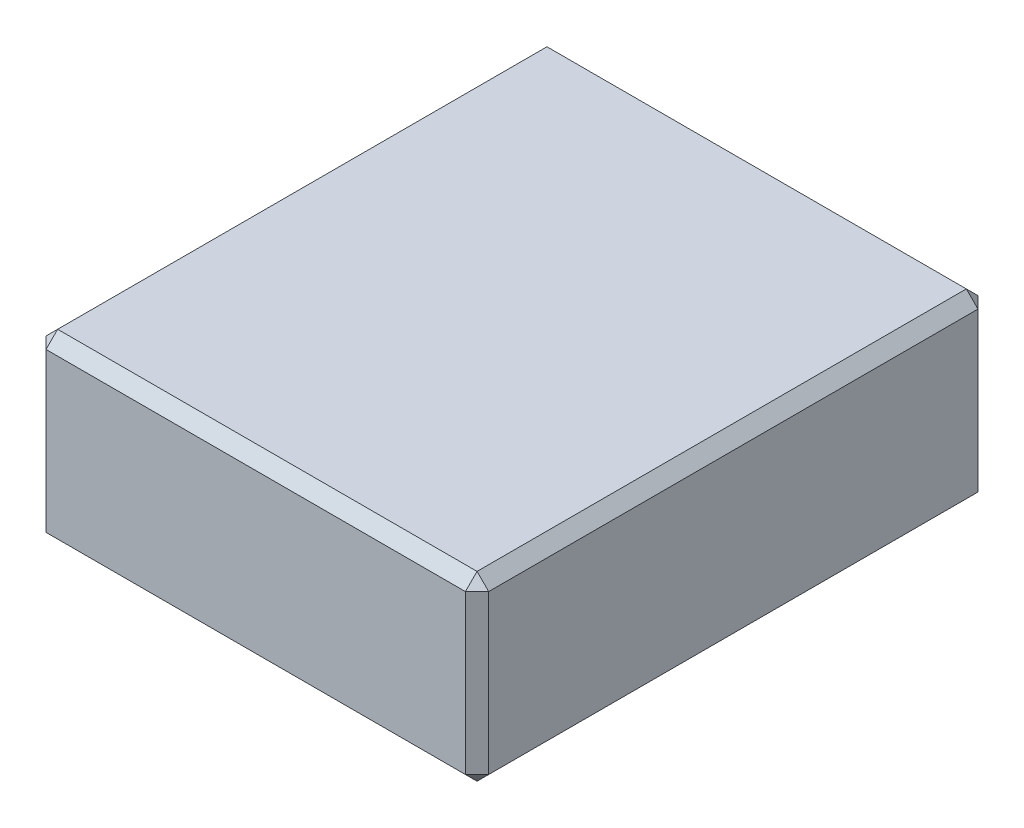
ISO-10303-21;
HEADER;
FILE_DESCRIPTION(('STEP AP214'),'2;1');
FILE_NAME('part.step','',(''),(''),'','','');
FILE_SCHEMA(('AUTOMOTIVE_DESIGN { 1 0 10303 214 1 1 1 1 }'));
ENDSEC;
DATA;
#1=APPLICATION_CONTEXT('core data for automotive mechanical design processes');
#2=APPLICATION_PROTOCOL_DEFINITION('international standard','automotive_design',2000,#1);
#3=PRODUCT_CONTEXT('',#1,'mechanical');
#4=PRODUCT('Part','Part','',(#3));
#5=PRODUCT_RELATED_PRODUCT_CATEGORY('part','',(#4));
#6=PRODUCT_DEFINITION_FORMATION('','',#4);
#7=PRODUCT_DEFINITION_CONTEXT('part definition',#1,'design');
#8=PRODUCT_DEFINITION('design','',#6,#7);
#9=PRODUCT_DEFINITION_SHAPE('','',#8);
#10=(LENGTH_UNIT() NAMED_UNIT(*) SI_UNIT(.MILLI.,.METRE.));
#11=(NAMED_UNIT(*) PLANE_ANGLE_UNIT() SI_UNIT($,.RADIAN.));
#12=(NAMED_UNIT(*) SI_UNIT($,.STERADIAN.) SOLID_ANGLE_UNIT());
#13=UNCERTAINTY_MEASURE_WITH_UNIT(LENGTH_MEASURE(1.E-05),#10,'distance_accuracy_value','');
#14=(GEOMETRIC_REPRESENTATION_CONTEXT(3) GLOBAL_UNCERTAINTY_ASSIGNED_CONTEXT((#13)) GLOBAL_UNIT_ASSIGNED_CONTEXT((#10,
#11,#12)) REPRESENTATION_CONTEXT('',''));
#15=CARTESIAN_POINT('',(0.,0.,0.));
#16=DIRECTION('',(0.,0.,1.));
#17=DIRECTION('',(1.,0.,0.));
#18=AXIS2_PLACEMENT_3D('',#15,#16,#17);
#19=CARTESIAN_POINT('',(95.,78.,110.));
#20=DIRECTION('',(-1.,0.,0.));
#21=DIRECTION('',(0.,0.,1.));
#22=AXIS2_PLACEMENT_3D('',#19,#20,#21);
#23=PLANE('',#22);
#24=DIRECTION('',(0.,0.,-1.));
#25=VECTOR('',#24,1.);
#26=CARTESIAN_POINT('',(95.,5.00000000000003,-110.));
#27=LINE('',#26,#25);
#28=CARTESIAN_POINT('',(95.,5.00000000000003,105.));
#29=VERTEX_POINT('',#28);
#30=CARTESIAN_POINT('',(95.,5.00000000000003,-105.));
#31=VERTEX_POINT('',#30);
#32=EDGE_CURVE('E200',#29,#31,#27,.T.);
#33=ORIENTED_EDGE('',*,*,#32,.T.);
#34=DIRECTION('',(0.,1.,0.));
#35=VECTOR('',#34,1.);
#36=CARTESIAN_POINT('',(95.,78.,-105.));
#37=LINE('',#36,#35);
#38=CARTESIAN_POINT('',(95.,73.,-105.));
#39=VERTEX_POINT('',#38);
#40=EDGE_CURVE('E203',#31,#39,#37,.T.);
#41=ORIENTED_EDGE('',*,*,#40,.T.);
#42=DIRECTION('',(0.,0.,1.));
#43=VECTOR('',#42,1.);
#44=CARTESIAN_POINT('',(95.,73.,110.));
#45=LINE('',#44,#43);
#46=CARTESIAN_POINT('',(95.,73.,105.));
#47=VERTEX_POINT('',#46);
#48=EDGE_CURVE('E194',#39,#47,#45,.T.);
#49=ORIENTED_EDGE('',*,*,#48,.T.);
#50=DIRECTION('',(0.,-1.,0.));
#51=VECTOR('',#50,1.);
#52=CARTESIAN_POINT('',(95.,78.,105.));
#53=LINE('',#52,#51);
#54=EDGE_CURVE('E197',#47,#29,#53,.T.);
#55=ORIENTED_EDGE('',*,*,#54,.T.);
#56=EDGE_LOOP('',(#33,#41,#49,#55));
#57=FACE_BOUND('',#56,.T.);
#58=ADVANCED_FACE('F41',(#57),#23,.F.);
#59=CARTESIAN_POINT('',(-95.,78.,-110.));
#60=DIRECTION('',(0.,0.,1.));
#61=DIRECTION('',(1.,0.,0.));
#62=AXIS2_PLACEMENT_3D('',#59,#60,#61);
#63=PLANE('',#62);
#64=DIRECTION('',(0.,-1.,0.));
#65=VECTOR('',#64,1.);
#66=CARTESIAN_POINT('',(90.,78.,-110.));
#67=LINE('',#66,#65);
#68=CARTESIAN_POINT('',(90.,73.,-110.));
#69=VERTEX_POINT('',#68);
#70=CARTESIAN_POINT('',(90.,5.,-110.));
#71=VERTEX_POINT('',#70);
#72=EDGE_CURVE('E184',#69,#71,#67,.T.);
#73=ORIENTED_EDGE('',*,*,#72,.T.);
#74=DIRECTION('',(-1.,0.,0.));
#75=VECTOR('',#74,1.);
#76=CARTESIAN_POINT('',(-95.,5.,-110.));
#77=LINE('',#76,#75);
#78=CARTESIAN_POINT('',(-90.,5.,-110.));
#79=VERTEX_POINT('',#78);
#80=EDGE_CURVE('E191',#71,#79,#77,.T.);
#81=ORIENTED_EDGE('',*,*,#80,.T.);
#82=DIRECTION('',(0.,1.,0.));
#83=VECTOR('',#82,1.);
#84=CARTESIAN_POINT('',(-90.,78.,-110.));
#85=LINE('',#84,#83);
#86=CARTESIAN_POINT('',(-90.,73.,-110.));
#87=VERTEX_POINT('',#86);
#88=EDGE_CURVE('E187',#79,#87,#85,.T.);
#89=ORIENTED_EDGE('',*,*,#88,.T.);
#90=DIRECTION('',(1.,0.,0.));
#91=VECTOR('',#90,1.);
#92=CARTESIAN_POINT('',(-95.,73.,-110.));
#93=LINE('',#92,#91);
#94=EDGE_CURVE('E181',#87,#69,#93,.T.);
#95=ORIENTED_EDGE('',*,*,#94,.T.);
#96=EDGE_LOOP('',(#73,#81,#89,#95));
#97=FACE_BOUND('',#96,.T.);
#98=ADVANCED_FACE('F361',(#97),#63,.F.);
#99=CARTESIAN_POINT('',(-95.,78.,110.));
#100=DIRECTION('',(1.,0.,0.));
#101=DIRECTION('',(0.,0.,-1.));
#102=AXIS2_PLACEMENT_3D('',#99,#100,#101);
#103=PLANE('',#102);
#104=DIRECTION('',(0.,-1.,0.));
#105=VECTOR('',#104,1.);
#106=CARTESIAN_POINT('',(-95.,78.,-105.));
#107=LINE('',#106,#105);
#108=CARTESIAN_POINT('',(-95.,73.,-105.));
#109=VERTEX_POINT('',#108);
#110=CARTESIAN_POINT('',(-95.,5.,-105.));
#111=VERTEX_POINT('',#110);
#112=EDGE_CURVE('E143',#109,#111,#107,.T.);
#113=ORIENTED_EDGE('',*,*,#112,.T.);
#114=DIRECTION('',(0.,0.,1.));
#115=VECTOR('',#114,1.);
#116=CARTESIAN_POINT('',(-95.,5.,110.));
#117=LINE('',#116,#115);
#118=CARTESIAN_POINT('',(-95.,5.,105.));
#119=VERTEX_POINT('',#118);
#120=EDGE_CURVE('E138',#111,#119,#117,.T.);
#121=ORIENTED_EDGE('',*,*,#120,.T.);
#122=DIRECTION('',(0.,1.,0.));
#123=VECTOR('',#122,1.);
#124=CARTESIAN_POINT('',(-95.,78.,105.));
#125=LINE('',#124,#123);
#126=CARTESIAN_POINT('',(-95.,73.,105.));
#127=VERTEX_POINT('',#126);
#128=EDGE_CURVE('E130',#119,#127,#125,.T.);
#129=ORIENTED_EDGE('',*,*,#128,.T.);
#130=DIRECTION('',(0.,0.,-1.));
#131=VECTOR('',#130,1.);
#132=CARTESIAN_POINT('',(-95.,73.,110.));
#133=LINE('',#132,#131);
#134=EDGE_CURVE('E135',#127,#109,#133,.T.);
#135=ORIENTED_EDGE('',*,*,#134,.T.);
#136=EDGE_LOOP('',(#113,#121,#129,#135));
#137=FACE_BOUND('',#136,.T.);
#138=ADVANCED_FACE('F133',(#137),#103,.F.);
#139=CARTESIAN_POINT('',(-95.,78.,110.));
#140=DIRECTION('',(0.,0.,-1.));
#141=DIRECTION('',(-1.,0.,0.));
#142=AXIS2_PLACEMENT_3D('',#139,#140,#141);
#143=PLANE('',#142);
#144=DIRECTION('',(-1.,0.,0.));
#145=VECTOR('',#144,1.);
#146=CARTESIAN_POINT('',(-95.,73.,110.));
#147=LINE('',#146,#145);
#148=CARTESIAN_POINT('',(90.,73.,110.));
#149=VERTEX_POINT('',#148);
#150=CARTESIAN_POINT('',(-90.,73.,110.));
#151=VERTEX_POINT('',#150);
#152=EDGE_CURVE('E207',#149,#151,#147,.T.);
#153=ORIENTED_EDGE('',*,*,#152,.T.);
#154=DIRECTION('',(0.,-1.,0.));
#155=VECTOR('',#154,1.);
#156=CARTESIAN_POINT('',(-90.,78.,110.));
#157=LINE('',#156,#155);
#158=CARTESIAN_POINT('',(-90.,5.,110.));
#159=VERTEX_POINT('',#158);
#160=EDGE_CURVE('E151',#151,#159,#157,.T.);
#161=ORIENTED_EDGE('',*,*,#160,.T.);
#162=DIRECTION('',(1.,0.,0.));
#163=VECTOR('',#162,1.);
#164=CARTESIAN_POINT('',(95.,5.,110.));
#165=LINE('',#164,#163);
#166=CARTESIAN_POINT('',(90.,5.,110.));
#167=VERTEX_POINT('',#166);
#168=EDGE_CURVE('E213',#159,#167,#165,.T.);
#169=ORIENTED_EDGE('',*,*,#168,.T.);
#170=DIRECTION('',(0.,1.,0.));
#171=VECTOR('',#170,1.);
#172=CARTESIAN_POINT('',(90.,78.,110.));
#173=LINE('',#172,#171);
#174=EDGE_CURVE('E210',#167,#149,#173,.T.);
#175=ORIENTED_EDGE('',*,*,#174,.T.);
#176=EDGE_LOOP('',(#153,#161,#169,#175));
#177=FACE_BOUND('',#176,.T.);
#178=ADVANCED_FACE('F352',(#177),#143,.F.);
#179=CARTESIAN_POINT('',(0.,78.,0.));
#180=DIRECTION('',(0.,-1.,0.));
#181=DIRECTION('',(0.,0.,-1.));
#182=AXIS2_PLACEMENT_3D('',#179,#180,#181);
#183=PLANE('',#182);
#184=DIRECTION('',(0.,0.,1.));
#185=VECTOR('',#184,1.);
#186=CARTESIAN_POINT('',(-90.,78.,0.));
#187=LINE('',#186,#185);
#188=CARTESIAN_POINT('',(-90.,78.,-105.));
#189=VERTEX_POINT('',#188);
#190=CARTESIAN_POINT('',(-90.,78.,105.));
#191=VERTEX_POINT('',#190);
#192=EDGE_CURVE('E52',#189,#191,#187,.T.);
#193=ORIENTED_EDGE('',*,*,#192,.T.);
#194=DIRECTION('',(1.,0.,0.));
#195=VECTOR('',#194,1.);
#196=CARTESIAN_POINT('',(0.,78.,105.));
#197=LINE('',#196,#195);
#198=CARTESIAN_POINT('',(90.,78.,105.));
#199=VERTEX_POINT('',#198);
#200=EDGE_CURVE('E11',#191,#199,#197,.T.);
#201=ORIENTED_EDGE('',*,*,#200,.T.);
#202=DIRECTION('',(0.,0.,-1.));
#203=VECTOR('',#202,1.);
#204=CARTESIAN_POINT('',(90.,78.,0.));
#205=LINE('',#204,#203);
#206=CARTESIAN_POINT('',(90.,78.,-105.));
#207=VERTEX_POINT('',#206);
#208=EDGE_CURVE('E231',#199,#207,#205,.T.);
#209=ORIENTED_EDGE('',*,*,#208,.T.);
#210=DIRECTION('',(-1.,0.,0.));
#211=VECTOR('',#210,1.);
#212=CARTESIAN_POINT('',(0.,78.,-105.));
#213=LINE('',#212,#211);
#214=EDGE_CURVE('E63',#207,#189,#213,.T.);
#215=ORIENTED_EDGE('',*,*,#214,.T.);
#216=EDGE_LOOP('',(#193,#201,#209,#215));
#217=FACE_BOUND('',#216,.T.);
#218=ADVANCED_FACE('F354',(#217),#183,.F.);
#219=CARTESIAN_POINT('',(0.,0.,0.));
#220=DIRECTION('',(0.,-1.,0.));
#221=DIRECTION('',(0.,0.,-1.));
#222=AXIS2_PLACEMENT_3D('',#219,#220,#221);
#223=PLANE('',#222);
#224=DIRECTION('',(0.,0.,-1.));
#225=VECTOR('',#224,1.);
#226=CARTESIAN_POINT('',(-90.,0.,-110.));
#227=LINE('',#226,#225);
#228=CARTESIAN_POINT('',(-90.,0.,105.));
#229=VERTEX_POINT('',#228);
#230=CARTESIAN_POINT('',(-90.,0.,-105.));
#231=VERTEX_POINT('',#230);
#232=EDGE_CURVE('E224',#229,#231,#227,.T.);
#233=ORIENTED_EDGE('',*,*,#232,.T.);
#234=DIRECTION('',(1.,0.,0.));
#235=VECTOR('',#234,1.);
#236=CARTESIAN_POINT('',(95.,0.,-105.));
#237=LINE('',#236,#235);
#238=CARTESIAN_POINT('',(90.,0.,-105.));
#239=VERTEX_POINT('',#238);
#240=EDGE_CURVE('E227',#231,#239,#237,.T.);
#241=ORIENTED_EDGE('',*,*,#240,.T.);
#242=DIRECTION('',(0.,0.,1.));
#243=VECTOR('',#242,1.);
#244=CARTESIAN_POINT('',(90.,0.,110.));
#245=LINE('',#244,#243);
#246=CARTESIAN_POINT('',(90.,0.,105.));
#247=VERTEX_POINT('',#246);
#248=EDGE_CURVE('E218',#239,#247,#245,.T.);
#249=ORIENTED_EDGE('',*,*,#248,.T.);
#250=DIRECTION('',(-1.,0.,0.));
#251=VECTOR('',#250,1.);
#252=CARTESIAN_POINT('',(-95.,0.,105.));
#253=LINE('',#252,#251);
#254=EDGE_CURVE('E221',#247,#229,#253,.T.);
#255=ORIENTED_EDGE('',*,*,#254,.T.);
#256=EDGE_LOOP('',(#233,#241,#249,#255));
#257=FACE_BOUND('',#256,.T.);
#258=ADVANCED_FACE('F322',(#257),#223,.T.);
#259=CARTESIAN_POINT('',(95.,78.,105.));
#260=DIRECTION('',(-0.707106781186549,0.,-0.707106781186545));
#261=DIRECTION('',(0.,-1.,0.));
#262=AXIS2_PLACEMENT_3D('',#259,#260,#261);
#263=PLANE('',#262);
#264=DIRECTION('',(-0.707106781186546,0.,0.707106781186549));
#265=VECTOR('',#264,1.);
#266=CARTESIAN_POINT('',(90.,73.,110.));
#267=LINE('',#266,#265);
#268=EDGE_CURVE('E46',#149,#47,#267,.F.);
#269=ORIENTED_EDGE('',*,*,#268,.F.);
#270=ORIENTED_EDGE('',*,*,#174,.F.);
#271=DIRECTION('',(0.707106781186546,0.,-0.707106781186549));
#272=VECTOR('',#271,1.);
#273=CARTESIAN_POINT('',(90.,5.,110.));
#274=LINE('',#273,#272);
#275=EDGE_CURVE('E175',#29,#167,#274,.F.);
#276=ORIENTED_EDGE('',*,*,#275,.F.);
#277=ORIENTED_EDGE('',*,*,#54,.F.);
#278=EDGE_LOOP('',(#269,#270,#276,#277));
#279=FACE_BOUND('',#278,.T.);
#280=ADVANCED_FACE('F44',(#279),#263,.F.);
#281=CARTESIAN_POINT('',(90.,73.,110.));
#282=DIRECTION('',(0.577350269189629,0.577350269189623,0.577350269189626));
#283=DIRECTION('',(0.707106781186545,0.,-0.707106781186549));
#284=AXIS2_PLACEMENT_3D('',#281,#282,#283);
#285=PLANE('',#284);
#286=DIRECTION('',(0.,0.707106781186549,-0.707106781186546));
#287=VECTOR('',#286,1.);
#288=CARTESIAN_POINT('',(90.,73.,110.));
#289=LINE('',#288,#287);
#290=EDGE_CURVE('E297',#149,#199,#289,.T.);
#291=ORIENTED_EDGE('',*,*,#290,.F.);
#292=ORIENTED_EDGE('',*,*,#268,.T.);
#293=DIRECTION('',(0.707106781186546,-0.707106781186549,0.));
#294=VECTOR('',#293,1.);
#295=CARTESIAN_POINT('',(92.5,75.5,105.));
#296=LINE('',#295,#294);
#297=EDGE_CURVE('E301',#199,#47,#296,.T.);
#298=ORIENTED_EDGE('',*,*,#297,.F.);
#299=EDGE_LOOP('',(#291,#292,#298));
#300=FACE_BOUND('',#299,.T.);
#301=ADVANCED_FACE('F347',(#300),#285,.T.);
#302=CARTESIAN_POINT('',(90.,5.,110.));
#303=DIRECTION('',(0.577350269189629,-0.577350269189626,0.577350269189623));
#304=DIRECTION('',(0.707106781186545,0.707106781186549,0.));
#305=AXIS2_PLACEMENT_3D('',#302,#303,#304);
#306=PLANE('',#305);
#307=DIRECTION('',(0.707106781186546,0.707106781186549,0.));
#308=VECTOR('',#307,1.);
#309=CARTESIAN_POINT('',(92.5,2.50000000000002,105.));
#310=LINE('',#309,#308);
#311=EDGE_CURVE('E289',#29,#247,#310,.F.);
#312=ORIENTED_EDGE('',*,*,#311,.F.);
#313=ORIENTED_EDGE('',*,*,#275,.T.);
#314=DIRECTION('',(0.,-0.707106781186546,-0.707106781186549));
#315=VECTOR('',#314,1.);
#316=CARTESIAN_POINT('',(90.,5.,110.));
#317=LINE('',#316,#315);
#318=EDGE_CURVE('E293',#247,#167,#317,.F.);
#319=ORIENTED_EDGE('',*,*,#318,.F.);
#320=EDGE_LOOP('',(#312,#313,#319));
#321=FACE_BOUND('',#320,.T.);
#322=ADVANCED_FACE('F310',(#321),#306,.T.);
#323=CARTESIAN_POINT('',(90.,78.,0.));
#324=DIRECTION('',(-0.707106781186549,-0.707106781186545,0.));
#325=DIRECTION('',(0.,0.,-1.));
#326=AXIS2_PLACEMENT_3D('',#323,#324,#325);
#327=PLANE('',#326);
#328=ORIENTED_EDGE('',*,*,#297,.T.);
#329=ORIENTED_EDGE('',*,*,#48,.F.);
#330=DIRECTION('',(-0.707106781186546,0.707106781186549,0.));
#331=VECTOR('',#330,1.);
#332=CARTESIAN_POINT('',(95.,73.,-105.));
#333=LINE('',#332,#331);
#334=EDGE_CURVE('E282',#207,#39,#333,.F.);
#335=ORIENTED_EDGE('',*,*,#334,.F.);
#336=ORIENTED_EDGE('',*,*,#208,.F.);
#337=EDGE_LOOP('',(#328,#329,#335,#336));
#338=FACE_BOUND('',#337,.T.);
#339=ADVANCED_FACE('F342',(#338),#327,.F.);
#340=CARTESIAN_POINT('',(0.,78.,105.));
#341=DIRECTION('',(0.,-0.707106781186545,-0.707106781186549));
#342=DIRECTION('',(1.,0.,0.));
#343=AXIS2_PLACEMENT_3D('',#340,#341,#342);
#344=PLANE('',#343);
#345=ORIENTED_EDGE('',*,*,#290,.T.);
#346=ORIENTED_EDGE('',*,*,#200,.F.);
#347=DIRECTION('',(0.,-0.707106781186549,0.707106781186546));
#348=VECTOR('',#347,1.);
#349=CARTESIAN_POINT('',(-90.,75.5,107.5));
#350=LINE('',#349,#348);
#351=EDGE_CURVE('E156',#151,#191,#350,.F.);
#352=ORIENTED_EDGE('',*,*,#351,.F.);
#353=ORIENTED_EDGE('',*,*,#152,.F.);
#354=EDGE_LOOP('',(#345,#346,#352,#353));
#355=FACE_BOUND('',#354,.T.);
#356=ADVANCED_FACE('F350',(#355),#344,.F.);
#357=CARTESIAN_POINT('',(-90.,78.,110.));
#358=DIRECTION('',(0.707106781186549,0.,-0.707106781186545));
#359=DIRECTION('',(0.,-1.,0.));
#360=AXIS2_PLACEMENT_3D('',#357,#358,#359);
#361=PLANE('',#360);
#362=DIRECTION('',(0.707106781186546,0.,0.707106781186549));
#363=VECTOR('',#362,1.);
#364=CARTESIAN_POINT('',(-90.,5.,110.));
#365=LINE('',#364,#363);
#366=EDGE_CURVE('E157',#159,#119,#365,.F.);
#367=ORIENTED_EDGE('',*,*,#366,.F.);
#368=ORIENTED_EDGE('',*,*,#160,.F.);
#369=DIRECTION('',(-0.707106781186546,0.,-0.707106781186549));
#370=VECTOR('',#369,1.);
#371=CARTESIAN_POINT('',(-95.,73.,105.));
#372=LINE('',#371,#370);
#373=EDGE_CURVE('E147',#127,#151,#372,.F.);
#374=ORIENTED_EDGE('',*,*,#373,.F.);
#375=ORIENTED_EDGE('',*,*,#128,.F.);
#376=EDGE_LOOP('',(#367,#368,#374,#375));
#377=FACE_BOUND('',#376,.T.);
#378=ADVANCED_FACE('F149',(#377),#361,.F.);
#379=CARTESIAN_POINT('',(-95.,5.,110.));
#380=DIRECTION('',(0.,-0.707106781186549,0.707106781186545));
#381=DIRECTION('',(-1.,0.,0.));
#382=AXIS2_PLACEMENT_3D('',#379,#380,#381);
#383=PLANE('',#382);
#384=ORIENTED_EDGE('',*,*,#318,.T.);
#385=ORIENTED_EDGE('',*,*,#168,.F.);
#386=DIRECTION('',(0.,0.707106781186546,0.707106781186549));
#387=VECTOR('',#386,1.);
#388=CARTESIAN_POINT('',(-90.,5.,110.));
#389=LINE('',#388,#387);
#390=EDGE_CURVE('E275',#229,#159,#389,.T.);
#391=ORIENTED_EDGE('',*,*,#390,.F.);
#392=ORIENTED_EDGE('',*,*,#254,.F.);
#393=EDGE_LOOP('',(#384,#385,#391,#392));
#394=FACE_BOUND('',#393,.T.);
#395=ADVANCED_FACE('F318',(#394),#383,.T.);
#396=CARTESIAN_POINT('',(95.,5.00000000000003,110.));
#397=DIRECTION('',(0.707106781186549,-0.707106781186545,0.));
#398=DIRECTION('',(0.,0.,1.));
#399=AXIS2_PLACEMENT_3D('',#396,#397,#398);
#400=PLANE('',#399);
#401=ORIENTED_EDGE('',*,*,#311,.T.);
#402=ORIENTED_EDGE('',*,*,#248,.F.);
#403=DIRECTION('',(-0.707106781186546,-0.707106781186549,0.));
#404=VECTOR('',#403,1.);
#405=CARTESIAN_POINT('',(92.5,2.50000000000002,-105.));
#406=LINE('',#405,#404);
#407=EDGE_CURVE('E271',#31,#239,#406,.T.);
#408=ORIENTED_EDGE('',*,*,#407,.F.);
#409=ORIENTED_EDGE('',*,*,#32,.F.);
#410=EDGE_LOOP('',(#401,#402,#408,#409));
#411=FACE_BOUND('',#410,.T.);
#412=ADVANCED_FACE('F328',(#411),#400,.T.);
#413=CARTESIAN_POINT('',(90.,78.,-110.));
#414=DIRECTION('',(-0.707106781186549,0.,0.707106781186547));
#415=DIRECTION('',(0.,-1.,0.));
#416=AXIS2_PLACEMENT_3D('',#413,#414,#415);
#417=PLANE('',#416);
#418=DIRECTION('',(0.707106781186546,0.,0.707106781186548));
#419=VECTOR('',#418,1.);
#420=CARTESIAN_POINT('',(95.,73.,-105.));
#421=LINE('',#420,#419);
#422=EDGE_CURVE('E285',#39,#69,#421,.F.);
#423=ORIENTED_EDGE('',*,*,#422,.F.);
#424=ORIENTED_EDGE('',*,*,#40,.F.);
#425=DIRECTION('',(-0.707106781186546,0.,-0.707106781186548));
#426=VECTOR('',#425,1.);
#427=CARTESIAN_POINT('',(90.,5.,-110.));
#428=LINE('',#427,#426);
#429=EDGE_CURVE('E267',#71,#31,#428,.F.);
#430=ORIENTED_EDGE('',*,*,#429,.F.);
#431=ORIENTED_EDGE('',*,*,#72,.F.);
#432=EDGE_LOOP('',(#423,#424,#430,#431));
#433=FACE_BOUND('',#432,.T.);
#434=ADVANCED_FACE('F334',(#433),#417,.F.);
#435=CARTESIAN_POINT('',(95.,73.,-105.));
#436=DIRECTION('',(0.577350269189628,0.577350269189623,-0.577350269189626));
#437=DIRECTION('',(-0.707106781186547,0.,-0.707106781186548));
#438=AXIS2_PLACEMENT_3D('',#435,#436,#437);
#439=PLANE('',#438);
#440=ORIENTED_EDGE('',*,*,#334,.T.);
#441=ORIENTED_EDGE('',*,*,#422,.T.);
#442=DIRECTION('',(0.,-0.707106781186549,-0.707106781186546));
#443=VECTOR('',#442,1.);
#444=CARTESIAN_POINT('',(90.,75.5,-107.5));
#445=LINE('',#444,#443);
#446=EDGE_CURVE('E164',#207,#69,#445,.T.);
#447=ORIENTED_EDGE('',*,*,#446,.F.);
#448=EDGE_LOOP('',(#440,#441,#447));
#449=FACE_BOUND('',#448,.T.);
#450=ADVANCED_FACE('F439',(#449),#439,.T.);
#451=CARTESIAN_POINT('',(-95.,73.,105.));
#452=DIRECTION('',(-0.577350269189629,0.577350269189623,0.577350269189626));
#453=DIRECTION('',(0.707106781186545,0.,0.707106781186549));
#454=AXIS2_PLACEMENT_3D('',#451,#452,#453);
#455=PLANE('',#454);
#456=ORIENTED_EDGE('',*,*,#373,.T.);
#457=ORIENTED_EDGE('',*,*,#351,.T.);
#458=DIRECTION('',(0.707106781186546,0.707106781186549,0.));
#459=VECTOR('',#458,1.);
#460=CARTESIAN_POINT('',(-95.,73.,105.));
#461=LINE('',#460,#459);
#462=EDGE_CURVE('E160',#127,#191,#461,.T.);
#463=ORIENTED_EDGE('',*,*,#462,.F.);
#464=EDGE_LOOP('',(#456,#457,#463));
#465=FACE_BOUND('',#464,.T.);
#466=ADVANCED_FACE('F161',(#465),#455,.T.);
#467=CARTESIAN_POINT('',(-90.,5.,110.));
#468=DIRECTION('',(-0.577350269189626,-0.577350269189629,0.577350269189623));
#469=DIRECTION('',(0.707106781186549,-0.707106781186545,0.));
#470=AXIS2_PLACEMENT_3D('',#467,#468,#469);
#471=PLANE('',#470);
#472=ORIENTED_EDGE('',*,*,#390,.T.);
#473=ORIENTED_EDGE('',*,*,#366,.T.);
#474=DIRECTION('',(0.707106781186549,-0.707106781186546,0.));
#475=VECTOR('',#474,1.);
#476=CARTESIAN_POINT('',(-92.5,2.5,105.));
#477=LINE('',#476,#475);
#478=EDGE_CURVE('E165',#229,#119,#477,.F.);
#479=ORIENTED_EDGE('',*,*,#478,.F.);
#480=EDGE_LOOP('',(#472,#473,#479));
#481=FACE_BOUND('',#480,.T.);
#482=ADVANCED_FACE('F426',(#481),#471,.T.);
#483=CARTESIAN_POINT('',(90.,5.,-110.));
#484=DIRECTION('',(0.577350269189628,-0.577350269189626,-0.577350269189623));
#485=DIRECTION('',(0.707106781186547,0.707106781186548,0.));
#486=AXIS2_PLACEMENT_3D('',#483,#484,#485);
#487=PLANE('',#486);
#488=ORIENTED_EDGE('',*,*,#429,.T.);
#489=ORIENTED_EDGE('',*,*,#407,.T.);
#490=DIRECTION('',(0.,0.707106781186546,-0.707106781186549));
#491=VECTOR('',#490,1.);
#492=CARTESIAN_POINT('',(90.,5.,-110.));
#493=LINE('',#492,#491);
#494=EDGE_CURVE('E258',#71,#239,#493,.F.);
#495=ORIENTED_EDGE('',*,*,#494,.F.);
#496=EDGE_LOOP('',(#488,#489,#495));
#497=FACE_BOUND('',#496,.T.);
#498=ADVANCED_FACE('F419',(#497),#487,.T.);
#499=CARTESIAN_POINT('',(0.,78.,-105.));
#500=DIRECTION('',(0.,-0.707106781186545,0.707106781186549));
#501=DIRECTION('',(-1.,0.,0.));
#502=AXIS2_PLACEMENT_3D('',#499,#500,#501);
#503=PLANE('',#502);
#504=ORIENTED_EDGE('',*,*,#446,.T.);
#505=ORIENTED_EDGE('',*,*,#94,.F.);
#506=DIRECTION('',(0.,0.707106781186549,0.707106781186546));
#507=VECTOR('',#506,1.);
#508=CARTESIAN_POINT('',(-90.,73.,-110.));
#509=LINE('',#508,#507);
#510=EDGE_CURVE('E254',#189,#87,#509,.F.);
#511=ORIENTED_EDGE('',*,*,#510,.F.);
#512=ORIENTED_EDGE('',*,*,#214,.F.);
#513=EDGE_LOOP('',(#504,#505,#511,#512));
#514=FACE_BOUND('',#513,.T.);
#515=ADVANCED_FACE('F413',(#514),#503,.F.);
#516=CARTESIAN_POINT('',(-90.,78.,0.));
#517=DIRECTION('',(0.707106781186549,-0.707106781186545,0.));
#518=DIRECTION('',(0.,0.,1.));
#519=AXIS2_PLACEMENT_3D('',#516,#517,#518);
#520=PLANE('',#519);
#521=ORIENTED_EDGE('',*,*,#462,.T.);
#522=ORIENTED_EDGE('',*,*,#192,.F.);
#523=DIRECTION('',(-0.707106781186546,-0.707106781186549,0.));
#524=VECTOR('',#523,1.);
#525=CARTESIAN_POINT('',(-92.5,75.5,-105.));
#526=LINE('',#525,#524);
#527=EDGE_CURVE('E169',#109,#189,#526,.F.);
#528=ORIENTED_EDGE('',*,*,#527,.F.);
#529=ORIENTED_EDGE('',*,*,#134,.F.);
#530=EDGE_LOOP('',(#521,#522,#528,#529));
#531=FACE_BOUND('',#530,.T.);
#532=ADVANCED_FACE('F167',(#531),#520,.F.);
#533=CARTESIAN_POINT('',(-95.,5.,110.));
#534=DIRECTION('',(-0.707106781186545,-0.707106781186549,0.));
#535=DIRECTION('',(0.,0.,-1.));
#536=AXIS2_PLACEMENT_3D('',#533,#534,#535);
#537=PLANE('',#536);
#538=ORIENTED_EDGE('',*,*,#478,.T.);
#539=ORIENTED_EDGE('',*,*,#120,.F.);
#540=DIRECTION('',(-0.707106781186549,0.707106781186545,0.));
#541=VECTOR('',#540,1.);
#542=CARTESIAN_POINT('',(-95.,5.,-105.));
#543=LINE('',#542,#541);
#544=EDGE_CURVE('E248',#231,#111,#543,.T.);
#545=ORIENTED_EDGE('',*,*,#544,.F.);
#546=ORIENTED_EDGE('',*,*,#232,.F.);
#547=EDGE_LOOP('',(#538,#539,#545,#546));
#548=FACE_BOUND('',#547,.T.);
#549=ADVANCED_FACE('F400',(#548),#537,.T.);
#550=CARTESIAN_POINT('',(-95.,5.,-110.));
#551=DIRECTION('',(0.,-0.707106781186549,-0.707106781186545));
#552=DIRECTION('',(1.,0.,0.));
#553=AXIS2_PLACEMENT_3D('',#550,#551,#552);
#554=PLANE('',#553);
#555=ORIENTED_EDGE('',*,*,#494,.T.);
#556=ORIENTED_EDGE('',*,*,#240,.F.);
#557=DIRECTION('',(0.,-0.707106781186546,0.70710678118655));
#558=VECTOR('',#557,1.);
#559=CARTESIAN_POINT('',(-90.,2.49999999999999,-107.5));
#560=LINE('',#559,#558);
#561=EDGE_CURVE('E244',#79,#231,#560,.T.);
#562=ORIENTED_EDGE('',*,*,#561,.F.);
#563=ORIENTED_EDGE('',*,*,#80,.F.);
#564=EDGE_LOOP('',(#555,#556,#562,#563));
#565=FACE_BOUND('',#564,.T.);
#566=ADVANCED_FACE('F393',(#565),#554,.T.);
#567=CARTESIAN_POINT('',(-90.,73.,-110.));
#568=DIRECTION('',(-0.577350269189627,0.577350269189622,-0.577350269189628));
#569=DIRECTION('',(-0.707106781186548,0.,0.707106781186546));
#570=AXIS2_PLACEMENT_3D('',#567,#568,#569);
#571=PLANE('',#570);
#572=ORIENTED_EDGE('',*,*,#527,.T.);
#573=ORIENTED_EDGE('',*,*,#510,.T.);
#574=DIRECTION('',(0.707106781186548,0.,-0.707106781186546));
#575=VECTOR('',#574,1.);
#576=CARTESIAN_POINT('',(-90.,73.,-110.));
#577=LINE('',#576,#575);
#578=EDGE_CURVE('E241',#109,#87,#577,.T.);
#579=ORIENTED_EDGE('',*,*,#578,.F.);
#580=EDGE_LOOP('',(#572,#573,#579));
#581=FACE_BOUND('',#580,.T.);
#582=ADVANCED_FACE('F386',(#581),#571,.T.);
#583=CARTESIAN_POINT('',(-95.,5.,-105.));
#584=DIRECTION('',(-0.577350269189624,-0.577350269189628,-0.577350269189625));
#585=DIRECTION('',(0.,0.707106781186546,-0.707106781186549));
#586=AXIS2_PLACEMENT_3D('',#583,#584,#585);
#587=PLANE('',#586);
#588=ORIENTED_EDGE('',*,*,#561,.T.);
#589=ORIENTED_EDGE('',*,*,#544,.T.);
#590=DIRECTION('',(-0.707106781186549,0.,0.707106781186547));
#591=VECTOR('',#590,1.);
#592=CARTESIAN_POINT('',(-95.,5.,-105.));
#593=LINE('',#592,#591);
#594=EDGE_CURVE('E238',#79,#111,#593,.T.);
#595=ORIENTED_EDGE('',*,*,#594,.F.);
#596=EDGE_LOOP('',(#588,#589,#595));
#597=FACE_BOUND('',#596,.T.);
#598=ADVANCED_FACE('F379',(#597),#587,.T.);
#599=CARTESIAN_POINT('',(-95.,78.,-105.));
#600=DIRECTION('',(0.707106781186546,0.,0.707106781186548));
#601=DIRECTION('',(0.,-1.,0.));
#602=AXIS2_PLACEMENT_3D('',#599,#600,#601);
#603=PLANE('',#602);
#604=ORIENTED_EDGE('',*,*,#578,.T.);
#605=ORIENTED_EDGE('',*,*,#88,.F.);
#606=ORIENTED_EDGE('',*,*,#594,.T.);
#607=ORIENTED_EDGE('',*,*,#112,.F.);
#608=EDGE_LOOP('',(#604,#605,#606,#607));
#609=FACE_BOUND('',#608,.T.);
#610=ADVANCED_FACE('F373',(#609),#603,.F.);
#611=CLOSED_SHELL('',(#58,#98,#138,#178,#218,#258,#280,#301,#322,#339,#356,#378,#395,#412,#434,
#450,#466,#482,#498,#515,#532,#549,#566,#582,#598,#610));
#612=MANIFOLD_SOLID_BREP('B2',#611);
#613=ADVANCED_BREP_SHAPE_REPRESENTATION('',(#18,#612),#14);
#614=SHAPE_DEFINITION_REPRESENTATION(#9,#613);
ENDSEC;
END-ISO-10303-21;
